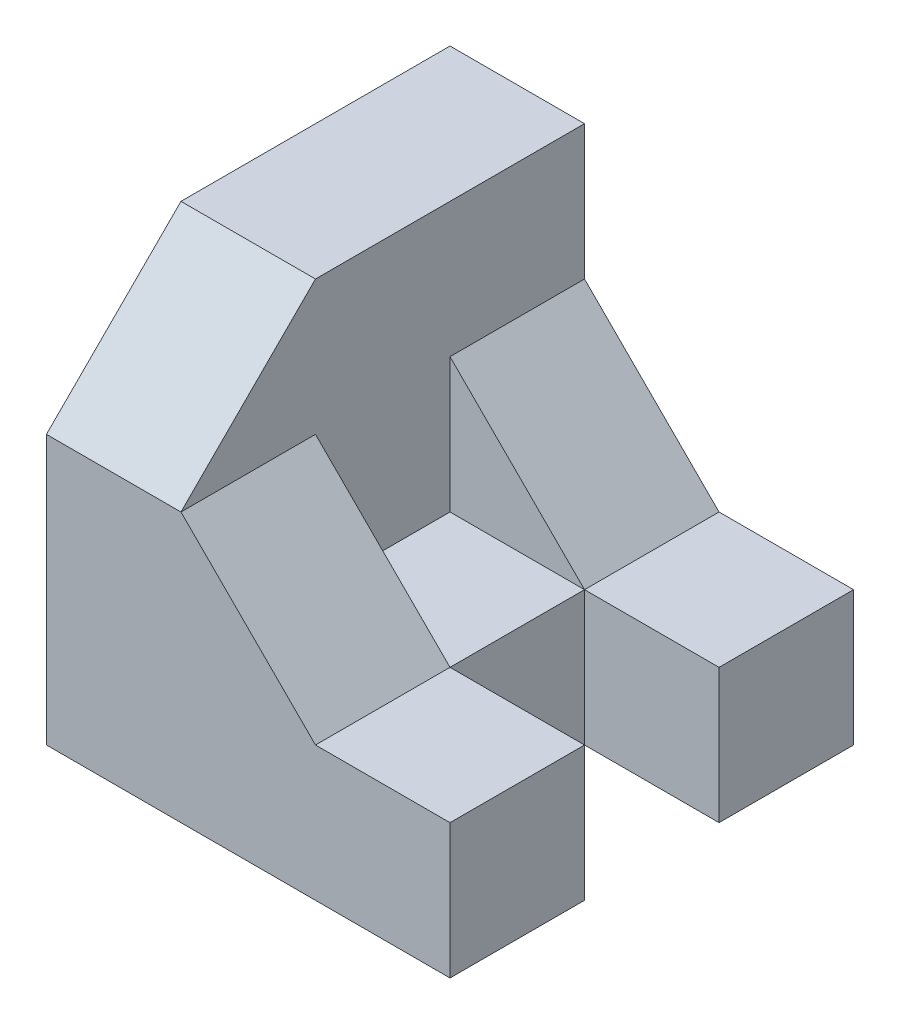
ISO-10303-21;
HEADER;
FILE_DESCRIPTION(('STEP AP214'),'2;1');
FILE_NAME('part.step','',(''),(''),'','','');
FILE_SCHEMA(('AUTOMOTIVE_DESIGN { 1 0 10303 214 1 1 1 1 }'));
ENDSEC;
DATA;
#1=APPLICATION_CONTEXT('core data for automotive mechanical design processes');
#2=APPLICATION_PROTOCOL_DEFINITION('international standard','automotive_design',2000,#1);
#3=PRODUCT_CONTEXT('',#1,'mechanical');
#4=PRODUCT('Part','Part','',(#3));
#5=PRODUCT_RELATED_PRODUCT_CATEGORY('part','',(#4));
#6=PRODUCT_DEFINITION_FORMATION('','',#4);
#7=PRODUCT_DEFINITION_CONTEXT('part definition',#1,'design');
#8=PRODUCT_DEFINITION('design','',#6,#7);
#9=PRODUCT_DEFINITION_SHAPE('','',#8);
#10=(LENGTH_UNIT() NAMED_UNIT(*) SI_UNIT(.MILLI.,.METRE.));
#11=(NAMED_UNIT(*) PLANE_ANGLE_UNIT() SI_UNIT($,.RADIAN.));
#12=(NAMED_UNIT(*) SI_UNIT($,.STERADIAN.) SOLID_ANGLE_UNIT());
#13=UNCERTAINTY_MEASURE_WITH_UNIT(LENGTH_MEASURE(1.E-05),#10,'distance_accuracy_value','');
#14=(GEOMETRIC_REPRESENTATION_CONTEXT(3) GLOBAL_UNCERTAINTY_ASSIGNED_CONTEXT((#13)) GLOBAL_UNIT_ASSIGNED_CONTEXT((#10,
#11,#12)) REPRESENTATION_CONTEXT('',''));
#15=CARTESIAN_POINT('',(0.,0.,0.));
#16=DIRECTION('',(0.,0.,1.));
#17=DIRECTION('',(1.,0.,0.));
#18=AXIS2_PLACEMENT_3D('',#15,#16,#17);
#19=CARTESIAN_POINT('',(20.,0.,-20.));
#20=DIRECTION('',(0.,0.,1.));
#21=DIRECTION('',(1.,0.,0.));
#22=AXIS2_PLACEMENT_3D('',#19,#20,#21);
#23=PLANE('',#22);
#24=DIRECTION('',(-1.,0.,0.));
#25=VECTOR('',#24,1.);
#26=CARTESIAN_POINT('',(60.,20.,-20.));
#27=LINE('',#26,#25);
#28=CARTESIAN_POINT('',(60.,20.,-20.));
#29=VERTEX_POINT('',#28);
#30=CARTESIAN_POINT('',(40.,20.,-20.));
#31=VERTEX_POINT('',#30);
#32=EDGE_CURVE('E146',#29,#31,#27,.T.);
#33=ORIENTED_EDGE('',*,*,#32,.F.);
#34=DIRECTION('',(0.,1.,0.));
#35=VECTOR('',#34,1.);
#36=CARTESIAN_POINT('',(60.,0.,-20.));
#37=LINE('',#36,#35);
#38=CARTESIAN_POINT('',(60.,0.,-20.));
#39=VERTEX_POINT('',#38);
#40=EDGE_CURVE('E234',#39,#29,#37,.T.);
#41=ORIENTED_EDGE('',*,*,#40,.F.);
#42=DIRECTION('',(1.,0.,0.));
#43=VECTOR('',#42,1.);
#44=CARTESIAN_POINT('',(20.,0.,-20.));
#45=LINE('',#44,#43);
#46=CARTESIAN_POINT('',(40.,0.,-20.));
#47=VERTEX_POINT('',#46);
#48=EDGE_CURVE('E227',#47,#39,#45,.T.);
#49=ORIENTED_EDGE('',*,*,#48,.F.);
#50=DIRECTION('',(0.,1.,0.));
#51=VECTOR('',#50,1.);
#52=CARTESIAN_POINT('',(40.,0.,-20.));
#53=LINE('',#52,#51);
#54=EDGE_CURVE('E196',#47,#31,#53,.T.);
#55=ORIENTED_EDGE('',*,*,#54,.T.);
#56=EDGE_LOOP('',(#33,#41,#49,#55));
#57=FACE_BOUND('',#56,.T.);
#58=ADVANCED_FACE('F39',(#57),#23,.F.);
#59=CARTESIAN_POINT('',(60.,0.,-60.));
#60=DIRECTION('',(1.,0.,0.));
#61=DIRECTION('',(0.,1.,0.));
#62=AXIS2_PLACEMENT_3D('',#59,#60,#61);
#63=PLANE('',#62);
#64=ORIENTED_EDGE('',*,*,#40,.T.);
#65=DIRECTION('',(0.,0.,-1.));
#66=VECTOR('',#65,1.);
#67=CARTESIAN_POINT('',(60.,20.,0.));
#68=LINE('',#67,#66);
#69=CARTESIAN_POINT('',(60.,20.,0.));
#70=VERTEX_POINT('',#69);
#71=EDGE_CURVE('E164',#70,#29,#68,.T.);
#72=ORIENTED_EDGE('',*,*,#71,.F.);
#73=DIRECTION('',(0.,1.,0.));
#74=VECTOR('',#73,1.);
#75=CARTESIAN_POINT('',(60.,0.,0.));
#76=LINE('',#75,#74);
#77=CARTESIAN_POINT('',(60.,0.,0.));
#78=VERTEX_POINT('',#77);
#79=EDGE_CURVE('E162',#78,#70,#76,.T.);
#80=ORIENTED_EDGE('',*,*,#79,.F.);
#81=DIRECTION('',(0.,0.,1.));
#82=VECTOR('',#81,1.);
#83=CARTESIAN_POINT('',(60.,0.,-60.));
#84=LINE('',#83,#82);
#85=EDGE_CURVE('E273',#39,#78,#84,.T.);
#86=ORIENTED_EDGE('',*,*,#85,.F.);
#87=EDGE_LOOP('',(#64,#72,#80,#86));
#88=FACE_BOUND('',#87,.T.);
#89=ADVANCED_FACE('F314',(#88),#63,.T.);
#90=CARTESIAN_POINT('',(0.,0.,0.));
#91=DIRECTION('',(0.,0.,1.));
#92=DIRECTION('',(1.,0.,0.));
#93=AXIS2_PLACEMENT_3D('',#90,#91,#92);
#94=PLANE('',#93);
#95=ORIENTED_EDGE('',*,*,#79,.T.);
#96=DIRECTION('',(1.,0.,0.));
#97=VECTOR('',#96,1.);
#98=CARTESIAN_POINT('',(40.,20.,0.));
#99=LINE('',#98,#97);
#100=CARTESIAN_POINT('',(40.,20.,0.));
#101=VERTEX_POINT('',#100);
#102=EDGE_CURVE('E143',#101,#70,#99,.T.);
#103=ORIENTED_EDGE('',*,*,#102,.F.);
#104=DIRECTION('',(-0.707106781186548,0.707106781186547,0.));
#105=VECTOR('',#104,1.);
#106=CARTESIAN_POINT('',(20.,40.,0.));
#107=LINE('',#106,#105);
#108=CARTESIAN_POINT('',(20.,40.,0.));
#109=VERTEX_POINT('',#108);
#110=EDGE_CURVE('E159',#101,#109,#107,.T.);
#111=ORIENTED_EDGE('',*,*,#110,.T.);
#112=DIRECTION('',(1.,0.,0.));
#113=VECTOR('',#112,1.);
#114=CARTESIAN_POINT('',(0.,40.,0.));
#115=LINE('',#114,#113);
#116=CARTESIAN_POINT('',(0.,40.,0.));
#117=VERTEX_POINT('',#116);
#118=EDGE_CURVE('E177',#117,#109,#115,.T.);
#119=ORIENTED_EDGE('',*,*,#118,.F.);
#120=DIRECTION('',(0.,-1.,0.));
#121=VECTOR('',#120,1.);
#122=CARTESIAN_POINT('',(0.,60.,0.));
#123=LINE('',#122,#121);
#124=CARTESIAN_POINT('',(0.,0.,0.));
#125=VERTEX_POINT('',#124);
#126=EDGE_CURVE('E238',#117,#125,#123,.T.);
#127=ORIENTED_EDGE('',*,*,#126,.T.);
#128=DIRECTION('',(1.,0.,0.));
#129=VECTOR('',#128,1.);
#130=CARTESIAN_POINT('',(0.,0.,0.));
#131=LINE('',#130,#129);
#132=EDGE_CURVE('E267',#125,#78,#131,.T.);
#133=ORIENTED_EDGE('',*,*,#132,.T.);
#134=EDGE_LOOP('',(#95,#103,#111,#119,#127,#133));
#135=FACE_BOUND('',#134,.T.);
#136=ADVANCED_FACE('F158',(#135),#94,.T.);
#137=CARTESIAN_POINT('',(60.,0.,-40.));
#138=DIRECTION('',(0.,0.,-1.));
#139=DIRECTION('',(-1.,0.,0.));
#140=AXIS2_PLACEMENT_3D('',#137,#138,#139);
#141=PLANE('',#140);
#142=DIRECTION('',(1.,0.,0.));
#143=VECTOR('',#142,1.);
#144=CARTESIAN_POINT('',(40.,20.,-40.));
#145=LINE('',#144,#143);
#146=CARTESIAN_POINT('',(40.,20.,-40.));
#147=VERTEX_POINT('',#146);
#148=CARTESIAN_POINT('',(60.,20.,-40.));
#149=VERTEX_POINT('',#148);
#150=EDGE_CURVE('E300',#147,#149,#145,.T.);
#151=ORIENTED_EDGE('',*,*,#150,.F.);
#152=DIRECTION('',(0.,1.,0.));
#153=VECTOR('',#152,1.);
#154=CARTESIAN_POINT('',(40.,0.,-40.));
#155=LINE('',#154,#153);
#156=CARTESIAN_POINT('',(40.,0.,-40.));
#157=VERTEX_POINT('',#156);
#158=EDGE_CURVE('E193',#157,#147,#155,.T.);
#159=ORIENTED_EDGE('',*,*,#158,.F.);
#160=DIRECTION('',(-1.,0.,0.));
#161=VECTOR('',#160,1.);
#162=CARTESIAN_POINT('',(60.,0.,-40.));
#163=LINE('',#162,#161);
#164=CARTESIAN_POINT('',(60.,0.,-40.));
#165=VERTEX_POINT('',#164);
#166=EDGE_CURVE('E223',#165,#157,#163,.T.);
#167=ORIENTED_EDGE('',*,*,#166,.F.);
#168=DIRECTION('',(0.,1.,0.));
#169=VECTOR('',#168,1.);
#170=CARTESIAN_POINT('',(60.,0.,-40.));
#171=LINE('',#170,#169);
#172=EDGE_CURVE('E230',#165,#149,#171,.T.);
#173=ORIENTED_EDGE('',*,*,#172,.T.);
#174=EDGE_LOOP('',(#151,#159,#167,#173));
#175=FACE_BOUND('',#174,.T.);
#176=ADVANCED_FACE('F322',(#175),#141,.F.);
#177=DIRECTION('',(0.,1.,0.));
#178=VECTOR('',#177,1.);
#179=CARTESIAN_POINT('',(60.,0.,-60.));
#180=LINE('',#179,#178);
#181=CARTESIAN_POINT('',(60.,0.,-60.));
#182=VERTEX_POINT('',#181);
#183=CARTESIAN_POINT('',(60.,20.,-60.));
#184=VERTEX_POINT('',#183);
#185=EDGE_CURVE('E258',#182,#184,#180,.T.);
#186=ORIENTED_EDGE('',*,*,#185,.T.);
#187=DIRECTION('',(0.,0.,-1.));
#188=VECTOR('',#187,1.);
#189=CARTESIAN_POINT('',(60.,20.,-40.));
#190=LINE('',#189,#188);
#191=EDGE_CURVE('E295',#149,#184,#190,.T.);
#192=ORIENTED_EDGE('',*,*,#191,.F.);
#193=ORIENTED_EDGE('',*,*,#172,.F.);
#194=EDGE_CURVE('E49',#182,#165,#84,.T.);
#195=ORIENTED_EDGE('',*,*,#194,.F.);
#196=EDGE_LOOP('',(#186,#192,#193,#195));
#197=FACE_BOUND('',#196,.T.);
#198=ADVANCED_FACE('F317',(#197),#63,.T.);
#199=CARTESIAN_POINT('',(0.,0.,-60.));
#200=DIRECTION('',(0.,0.,1.));
#201=DIRECTION('',(1.,0.,0.));
#202=AXIS2_PLACEMENT_3D('',#199,#200,#201);
#203=PLANE('',#202);
#204=DIRECTION('',(-1.,0.,0.));
#205=VECTOR('',#204,1.);
#206=CARTESIAN_POINT('',(60.,20.,-60.));
#207=LINE('',#206,#205);
#208=CARTESIAN_POINT('',(40.,20.,-60.));
#209=VERTEX_POINT('',#208);
#210=EDGE_CURVE('E303',#184,#209,#207,.T.);
#211=ORIENTED_EDGE('',*,*,#210,.F.);
#212=ORIENTED_EDGE('',*,*,#185,.F.);
#213=DIRECTION('',(1.,0.,0.));
#214=VECTOR('',#213,1.);
#215=CARTESIAN_POINT('',(0.,0.,-60.));
#216=LINE('',#215,#214);
#217=CARTESIAN_POINT('',(0.,0.,-60.));
#218=VERTEX_POINT('',#217);
#219=EDGE_CURVE('E254',#218,#182,#216,.T.);
#220=ORIENTED_EDGE('',*,*,#219,.F.);
#221=DIRECTION('',(0.,-1.,0.));
#222=VECTOR('',#221,1.);
#223=CARTESIAN_POINT('',(0.,60.,-60.));
#224=LINE('',#223,#222);
#225=CARTESIAN_POINT('',(0.,60.,-60.));
#226=VERTEX_POINT('',#225);
#227=EDGE_CURVE('E250',#226,#218,#224,.T.);
#228=ORIENTED_EDGE('',*,*,#227,.F.);
#229=DIRECTION('',(-1.,0.,0.));
#230=VECTOR('',#229,1.);
#231=CARTESIAN_POINT('',(60.,60.,-60.));
#232=LINE('',#231,#230);
#233=CARTESIAN_POINT('',(20.,60.,-60.));
#234=VERTEX_POINT('',#233);
#235=EDGE_CURVE('E262',#234,#226,#232,.T.);
#236=ORIENTED_EDGE('',*,*,#235,.F.);
#237=DIRECTION('',(0.,-1.,0.));
#238=VECTOR('',#237,1.);
#239=CARTESIAN_POINT('',(20.,40.,-60.));
#240=LINE('',#239,#238);
#241=CARTESIAN_POINT('',(20.,40.,-60.));
#242=VERTEX_POINT('',#241);
#243=EDGE_CURVE('E180',#234,#242,#240,.T.);
#244=ORIENTED_EDGE('',*,*,#243,.T.);
#245=DIRECTION('',(0.707106781186548,-0.707106781186547,0.));
#246=VECTOR('',#245,1.);
#247=CARTESIAN_POINT('',(20.,40.,-60.));
#248=LINE('',#247,#246);
#249=EDGE_CURVE('E65',#242,#209,#248,.T.);
#250=ORIENTED_EDGE('',*,*,#249,.T.);
#251=EDGE_LOOP('',(#211,#212,#220,#228,#236,#244,#250));
#252=FACE_BOUND('',#251,.T.);
#253=ADVANCED_FACE('F328',(#252),#203,.F.);
#254=DIRECTION('',(0.,1.,0.));
#255=VECTOR('',#254,1.);
#256=CARTESIAN_POINT('',(20.,0.,-20.));
#257=LINE('',#256,#255);
#258=CARTESIAN_POINT('',(20.,20.,-20.));
#259=VERTEX_POINT('',#258);
#260=CARTESIAN_POINT('',(20.,40.,-20.));
#261=VERTEX_POINT('',#260);
#262=EDGE_CURVE('E239',#259,#261,#257,.T.);
#263=ORIENTED_EDGE('',*,*,#262,.T.);
#264=DIRECTION('',(-0.707106781186548,0.707106781186547,0.));
#265=VECTOR('',#264,1.);
#266=CARTESIAN_POINT('',(20.,40.,-20.));
#267=LINE('',#266,#265);
#268=EDGE_CURVE('E169',#31,#261,#267,.T.);
#269=ORIENTED_EDGE('',*,*,#268,.F.);
#270=DIRECTION('',(-1.,0.,0.));
#271=VECTOR('',#270,1.);
#272=CARTESIAN_POINT('',(40.,20.,-20.));
#273=LINE('',#272,#271);
#274=EDGE_CURVE('E200',#31,#259,#273,.T.);
#275=ORIENTED_EDGE('',*,*,#274,.T.);
#276=EDGE_LOOP('',(#263,#269,#275));
#277=FACE_BOUND('',#276,.T.);
#278=ADVANCED_FACE('F325',(#277),#23,.F.);
#279=CARTESIAN_POINT('',(20.,0.,-40.));
#280=DIRECTION('',(-1.,0.,0.));
#281=DIRECTION('',(0.,0.,1.));
#282=AXIS2_PLACEMENT_3D('',#279,#280,#281);
#283=PLANE('',#282);
#284=DIRECTION('',(0.,0.,1.));
#285=VECTOR('',#284,1.);
#286=CARTESIAN_POINT('',(20.,60.,-40.));
#287=LINE('',#286,#285);
#288=CARTESIAN_POINT('',(20.,60.,-20.));
#289=VERTEX_POINT('',#288);
#290=EDGE_CURVE('E222',#234,#289,#287,.T.);
#291=ORIENTED_EDGE('',*,*,#290,.T.);
#292=DIRECTION('',(0.,0.707106781186548,-0.707106781186547));
#293=VECTOR('',#292,1.);
#294=CARTESIAN_POINT('',(20.,40.,0.));
#295=LINE('',#294,#293);
#296=EDGE_CURVE('E292',#109,#289,#295,.T.);
#297=ORIENTED_EDGE('',*,*,#296,.F.);
#298=DIRECTION('',(0.,0.,-1.));
#299=VECTOR('',#298,1.);
#300=CARTESIAN_POINT('',(20.,40.,0.));
#301=LINE('',#300,#299);
#302=EDGE_CURVE('E153',#109,#261,#301,.T.);
#303=ORIENTED_EDGE('',*,*,#302,.T.);
#304=ORIENTED_EDGE('',*,*,#262,.F.);
#305=DIRECTION('',(0.,0.,-1.));
#306=VECTOR('',#305,1.);
#307=CARTESIAN_POINT('',(20.,20.,-20.));
#308=LINE('',#307,#306);
#309=CARTESIAN_POINT('',(20.,20.,-40.));
#310=VERTEX_POINT('',#309);
#311=EDGE_CURVE('E204',#259,#310,#308,.T.);
#312=ORIENTED_EDGE('',*,*,#311,.T.);
#313=DIRECTION('',(0.,1.,0.));
#314=VECTOR('',#313,1.);
#315=CARTESIAN_POINT('',(20.,0.,-40.));
#316=LINE('',#315,#314);
#317=CARTESIAN_POINT('',(20.,40.,-40.));
#318=VERTEX_POINT('',#317);
#319=EDGE_CURVE('E243',#310,#318,#316,.T.);
#320=ORIENTED_EDGE('',*,*,#319,.T.);
#321=DIRECTION('',(0.,0.,1.));
#322=VECTOR('',#321,1.);
#323=CARTESIAN_POINT('',(20.,40.,-60.));
#324=LINE('',#323,#322);
#325=EDGE_CURVE('E186',#242,#318,#324,.T.);
#326=ORIENTED_EDGE('',*,*,#325,.F.);
#327=ORIENTED_EDGE('',*,*,#243,.F.);
#328=EDGE_LOOP('',(#291,#297,#303,#304,#312,#320,#326,#327));
#329=FACE_BOUND('',#328,.T.);
#330=ADVANCED_FACE('F359',(#329),#283,.F.);
#331=DIRECTION('',(-1.,0.,0.));
#332=VECTOR('',#331,1.);
#333=CARTESIAN_POINT('',(40.,20.,-40.));
#334=LINE('',#333,#332);
#335=EDGE_CURVE('E201',#147,#310,#334,.T.);
#336=ORIENTED_EDGE('',*,*,#335,.F.);
#337=DIRECTION('',(0.707106781186548,-0.707106781186547,0.));
#338=VECTOR('',#337,1.);
#339=CARTESIAN_POINT('',(20.,40.,-40.));
#340=LINE('',#339,#338);
#341=EDGE_CURVE('E152',#318,#147,#340,.T.);
#342=ORIENTED_EDGE('',*,*,#341,.F.);
#343=ORIENTED_EDGE('',*,*,#319,.F.);
#344=EDGE_LOOP('',(#336,#342,#343));
#345=FACE_BOUND('',#344,.T.);
#346=ADVANCED_FACE('F338',(#345),#141,.F.);
#347=CARTESIAN_POINT('',(0.,60.,-60.));
#348=DIRECTION('',(-1.,0.,0.));
#349=DIRECTION('',(0.,0.,1.));
#350=AXIS2_PLACEMENT_3D('',#347,#348,#349);
#351=PLANE('',#350);
#352=DIRECTION('',(0.,0.707106781186548,-0.707106781186547));
#353=VECTOR('',#352,1.);
#354=CARTESIAN_POINT('',(0.,40.,0.));
#355=LINE('',#354,#353);
#356=CARTESIAN_POINT('',(0.,60.,-20.));
#357=VERTEX_POINT('',#356);
#358=EDGE_CURVE('E57',#117,#357,#355,.T.);
#359=ORIENTED_EDGE('',*,*,#358,.T.);
#360=DIRECTION('',(0.,0.,1.));
#361=VECTOR('',#360,1.);
#362=CARTESIAN_POINT('',(0.,60.,-60.));
#363=LINE('',#362,#361);
#364=EDGE_CURVE('E11',#226,#357,#363,.T.);
#365=ORIENTED_EDGE('',*,*,#364,.F.);
#366=ORIENTED_EDGE('',*,*,#227,.T.);
#367=DIRECTION('',(0.,0.,1.));
#368=VECTOR('',#367,1.);
#369=CARTESIAN_POINT('',(0.,0.,-60.));
#370=LINE('',#369,#368);
#371=EDGE_CURVE('E43',#218,#125,#370,.T.);
#372=ORIENTED_EDGE('',*,*,#371,.T.);
#373=ORIENTED_EDGE('',*,*,#126,.F.);
#374=EDGE_LOOP('',(#359,#365,#366,#372,#373));
#375=FACE_BOUND('',#374,.T.);
#376=ADVANCED_FACE('F41',(#375),#351,.T.);
#377=CARTESIAN_POINT('',(60.,60.,-60.));
#378=DIRECTION('',(0.,1.,0.));
#379=DIRECTION('',(-1.,0.,0.));
#380=AXIS2_PLACEMENT_3D('',#377,#378,#379);
#381=PLANE('',#380);
#382=DIRECTION('',(1.,0.,0.));
#383=VECTOR('',#382,1.);
#384=CARTESIAN_POINT('',(0.,60.,-20.));
#385=LINE('',#384,#383);
#386=EDGE_CURVE('E174',#357,#289,#385,.T.);
#387=ORIENTED_EDGE('',*,*,#386,.T.);
#388=ORIENTED_EDGE('',*,*,#290,.F.);
#389=ORIENTED_EDGE('',*,*,#235,.T.);
#390=ORIENTED_EDGE('',*,*,#364,.T.);
#391=EDGE_LOOP('',(#387,#388,#389,#390));
#392=FACE_BOUND('',#391,.T.);
#393=ADVANCED_FACE('F363',(#392),#381,.T.);
#394=CARTESIAN_POINT('',(0.,0.,-60.));
#395=DIRECTION('',(0.,-1.,0.));
#396=DIRECTION('',(0.,0.,-1.));
#397=AXIS2_PLACEMENT_3D('',#394,#395,#396);
#398=PLANE('',#397);
#399=DIRECTION('',(0.,0.,-1.));
#400=VECTOR('',#399,1.);
#401=CARTESIAN_POINT('',(40.,0.,-20.));
#402=LINE('',#401,#400);
#403=EDGE_CURVE('E218',#47,#157,#402,.T.);
#404=ORIENTED_EDGE('',*,*,#403,.F.);
#405=ORIENTED_EDGE('',*,*,#48,.T.);
#406=ORIENTED_EDGE('',*,*,#85,.T.);
#407=ORIENTED_EDGE('',*,*,#132,.F.);
#408=ORIENTED_EDGE('',*,*,#371,.F.);
#409=ORIENTED_EDGE('',*,*,#219,.T.);
#410=ORIENTED_EDGE('',*,*,#194,.T.);
#411=ORIENTED_EDGE('',*,*,#166,.T.);
#412=EDGE_LOOP('',(#404,#405,#406,#407,#408,#409,#410,#411));
#413=FACE_BOUND('',#412,.T.);
#414=ADVANCED_FACE('F286',(#413),#398,.T.);
#415=CARTESIAN_POINT('',(40.,0.,-20.));
#416=DIRECTION('',(-1.,0.,0.));
#417=DIRECTION('',(0.,0.,1.));
#418=AXIS2_PLACEMENT_3D('',#415,#416,#417);
#419=PLANE('',#418);
#420=ORIENTED_EDGE('',*,*,#158,.T.);
#421=DIRECTION('',(0.,0.,-1.));
#422=VECTOR('',#421,1.);
#423=CARTESIAN_POINT('',(40.,20.,-20.));
#424=LINE('',#423,#422);
#425=EDGE_CURVE('E214',#31,#147,#424,.T.);
#426=ORIENTED_EDGE('',*,*,#425,.F.);
#427=ORIENTED_EDGE('',*,*,#54,.F.);
#428=ORIENTED_EDGE('',*,*,#403,.T.);
#429=EDGE_LOOP('',(#420,#426,#427,#428));
#430=FACE_BOUND('',#429,.T.);
#431=ADVANCED_FACE('F353',(#430),#419,.F.);
#432=CARTESIAN_POINT('',(40.,20.,-20.));
#433=DIRECTION('',(0.,-1.,0.));
#434=DIRECTION('',(1.,0.,0.));
#435=AXIS2_PLACEMENT_3D('',#432,#433,#434);
#436=PLANE('',#435);
#437=ORIENTED_EDGE('',*,*,#335,.T.);
#438=ORIENTED_EDGE('',*,*,#311,.F.);
#439=ORIENTED_EDGE('',*,*,#274,.F.);
#440=ORIENTED_EDGE('',*,*,#425,.T.);
#441=EDGE_LOOP('',(#437,#438,#439,#440));
#442=FACE_BOUND('',#441,.T.);
#443=ADVANCED_FACE('F355',(#442),#436,.F.);
#444=CARTESIAN_POINT('',(20.,40.,-60.));
#445=DIRECTION('',(-0.707106781186547,-0.707106781186548,0.));
#446=DIRECTION('',(0.707106781186548,-0.707106781186547,0.));
#447=AXIS2_PLACEMENT_3D('',#444,#445,#446);
#448=PLANE('',#447);
#449=ORIENTED_EDGE('',*,*,#341,.T.);
#450=DIRECTION('',(0.,0.,1.));
#451=VECTOR('',#450,1.);
#452=CARTESIAN_POINT('',(40.,20.,-60.));
#453=LINE('',#452,#451);
#454=EDGE_CURVE('E190',#209,#147,#453,.T.);
#455=ORIENTED_EDGE('',*,*,#454,.F.);
#456=ORIENTED_EDGE('',*,*,#249,.F.);
#457=ORIENTED_EDGE('',*,*,#325,.T.);
#458=EDGE_LOOP('',(#449,#455,#456,#457));
#459=FACE_BOUND('',#458,.T.);
#460=ADVANCED_FACE('F346',(#459),#448,.F.);
#461=CARTESIAN_POINT('',(20.,40.,0.));
#462=DIRECTION('',(-0.707106781186547,-0.707106781186548,0.));
#463=DIRECTION('',(0.707106781186548,-0.707106781186547,0.));
#464=AXIS2_PLACEMENT_3D('',#461,#462,#463);
#465=PLANE('',#464);
#466=ORIENTED_EDGE('',*,*,#268,.T.);
#467=ORIENTED_EDGE('',*,*,#302,.F.);
#468=ORIENTED_EDGE('',*,*,#110,.F.);
#469=DIRECTION('',(0.,0.,-1.));
#470=VECTOR('',#469,1.);
#471=CARTESIAN_POINT('',(40.,20.,0.));
#472=LINE('',#471,#470);
#473=EDGE_CURVE('E140',#101,#31,#472,.T.);
#474=ORIENTED_EDGE('',*,*,#473,.T.);
#475=EDGE_LOOP('',(#466,#467,#468,#474));
#476=FACE_BOUND('',#475,.T.);
#477=ADVANCED_FACE('F167',(#476),#465,.F.);
#478=CARTESIAN_POINT('',(0.,40.,0.));
#479=DIRECTION('',(0.,-0.707106781186547,-0.707106781186548));
#480=DIRECTION('',(0.,0.707106781186548,-0.707106781186547));
#481=AXIS2_PLACEMENT_3D('',#478,#479,#480);
#482=PLANE('',#481);
#483=ORIENTED_EDGE('',*,*,#296,.T.);
#484=ORIENTED_EDGE('',*,*,#386,.F.);
#485=ORIENTED_EDGE('',*,*,#358,.F.);
#486=ORIENTED_EDGE('',*,*,#118,.T.);
#487=EDGE_LOOP('',(#483,#484,#485,#486));
#488=FACE_BOUND('',#487,.T.);
#489=ADVANCED_FACE('F361',(#488),#482,.F.);
#490=CARTESIAN_POINT('',(0.,20.,0.));
#491=DIRECTION('',(0.,1.,0.));
#492=DIRECTION('',(0.,0.,1.));
#493=AXIS2_PLACEMENT_3D('',#490,#491,#492);
#494=PLANE('',#493);
#495=ORIENTED_EDGE('',*,*,#210,.T.);
#496=ORIENTED_EDGE('',*,*,#454,.T.);
#497=ORIENTED_EDGE('',*,*,#150,.T.);
#498=ORIENTED_EDGE('',*,*,#191,.T.);
#499=EDGE_LOOP('',(#495,#496,#497,#498));
#500=FACE_BOUND('',#499,.T.);
#501=ADVANCED_FACE('F344',(#500),#494,.T.);
#502=CARTESIAN_POINT('',(0.,20.,0.));
#503=DIRECTION('',(0.,1.,0.));
#504=DIRECTION('',(0.,0.,1.));
#505=AXIS2_PLACEMENT_3D('',#502,#503,#504);
#506=PLANE('',#505);
#507=ORIENTED_EDGE('',*,*,#32,.T.);
#508=ORIENTED_EDGE('',*,*,#473,.F.);
#509=ORIENTED_EDGE('',*,*,#102,.T.);
#510=ORIENTED_EDGE('',*,*,#71,.T.);
#511=EDGE_LOOP('',(#507,#508,#509,#510));
#512=FACE_BOUND('',#511,.T.);
#513=ADVANCED_FACE('F142',(#512),#506,.T.);
#514=CLOSED_SHELL('',(#58,#89,#136,#176,#198,#253,#278,#330,#346,#376,#393,#414,#431,#443,#460,
#477,#489,#501,#513));
#515=MANIFOLD_SOLID_BREP('B2',#514);
#516=ADVANCED_BREP_SHAPE_REPRESENTATION('',(#18,#515),#14);
#517=SHAPE_DEFINITION_REPRESENTATION(#9,#516);
ENDSEC;
END-ISO-10303-21;
